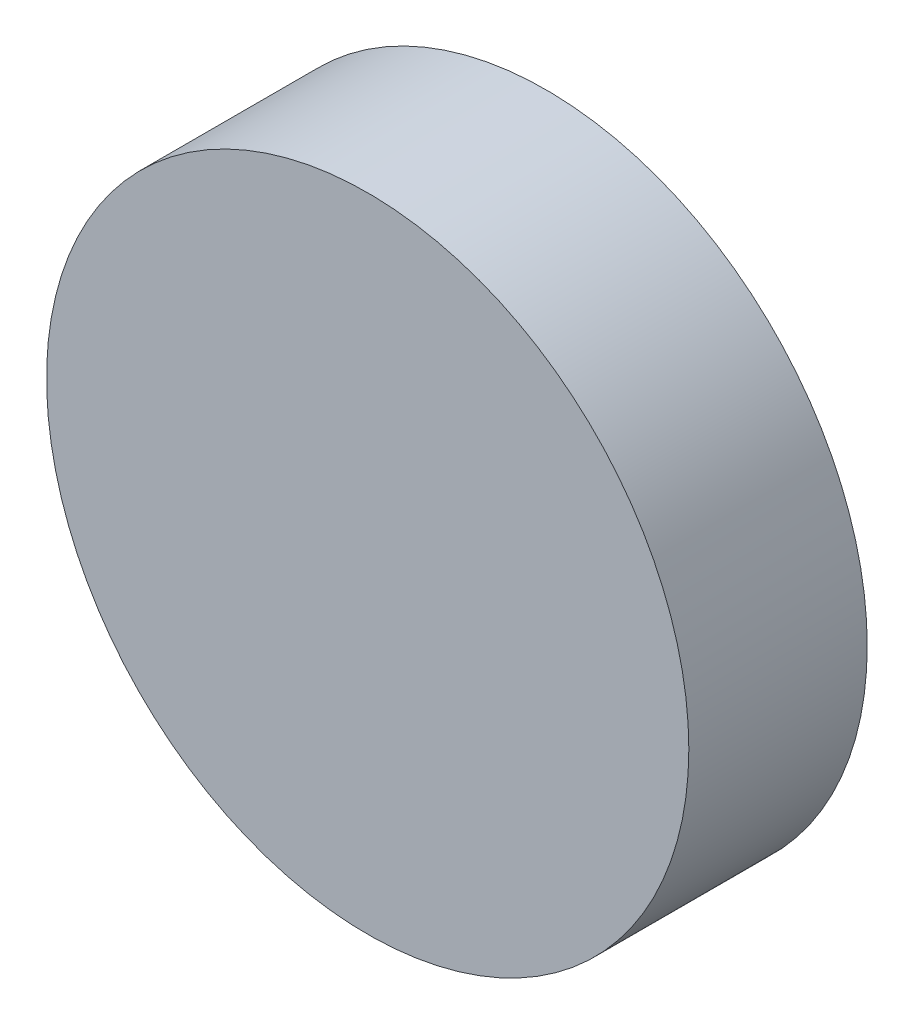
ISO-10303-21;
HEADER;
FILE_DESCRIPTION(('STEP AP214'),'2;1');
FILE_NAME('part.step','',(''),(''),'','','');
FILE_SCHEMA(('AUTOMOTIVE_DESIGN { 1 0 10303 214 1 1 1 1 }'));
ENDSEC;
DATA;
#1=APPLICATION_CONTEXT('core data for automotive mechanical design processes');
#2=APPLICATION_PROTOCOL_DEFINITION('international standard','automotive_design',2000,#1);
#3=PRODUCT_CONTEXT('',#1,'mechanical');
#4=PRODUCT('Part','Part','',(#3));
#5=PRODUCT_RELATED_PRODUCT_CATEGORY('part','',(#4));
#6=PRODUCT_DEFINITION_FORMATION('','',#4);
#7=PRODUCT_DEFINITION_CONTEXT('part definition',#1,'design');
#8=PRODUCT_DEFINITION('design','',#6,#7);
#9=PRODUCT_DEFINITION_SHAPE('','',#8);
#10=(LENGTH_UNIT() NAMED_UNIT(*) SI_UNIT(.MILLI.,.METRE.));
#11=(NAMED_UNIT(*) PLANE_ANGLE_UNIT() SI_UNIT($,.RADIAN.));
#12=(NAMED_UNIT(*) SI_UNIT($,.STERADIAN.) SOLID_ANGLE_UNIT());
#13=UNCERTAINTY_MEASURE_WITH_UNIT(LENGTH_MEASURE(1.E-05),#10,'distance_accuracy_value','');
#14=(GEOMETRIC_REPRESENTATION_CONTEXT(3) GLOBAL_UNCERTAINTY_ASSIGNED_CONTEXT((#13)) GLOBAL_UNIT_ASSIGNED_CONTEXT((#10,
#11,#12)) REPRESENTATION_CONTEXT('',''));
#15=CARTESIAN_POINT('',(0.,0.,0.));
#16=DIRECTION('',(0.,0.,1.));
#17=DIRECTION('',(1.,0.,0.));
#18=AXIS2_PLACEMENT_3D('',#15,#16,#17);
#19=CARTESIAN_POINT('',(40.5060478881834,0.762412285703871,5.));
#20=DIRECTION('',(0.,0.,-1.));
#21=DIRECTION('',(-1.,0.,0.));
#22=AXIS2_PLACEMENT_3D('',#19,#20,#21);
#23=CYLINDRICAL_SURFACE('',#22,9.);
#24=CARTESIAN_POINT('',(40.5060478881834,0.762412285703871,5.));
#25=DIRECTION('',(0.,0.,1.));
#26=DIRECTION('',(1.,0.,0.));
#27=AXIS2_PLACEMENT_3D('',#24,#25,#26);
#28=CIRCLE('',#27,9.);
#29=CARTESIAN_POINT('',(49.5060478881834,0.762412285703871,5.));
#30=VERTEX_POINT('',#29);
#31=EDGE_CURVE('E10',#30,#30,#28,.T.);
#32=ORIENTED_EDGE('',*,*,#31,.F.);
#33=EDGE_LOOP('',(#32));
#34=FACE_BOUND('',#33,.T.);
#35=CARTESIAN_POINT('',(40.5060478881834,0.762412285703871,0.));
#36=DIRECTION('',(0.,0.,1.));
#37=DIRECTION('',(1.,0.,0.));
#38=AXIS2_PLACEMENT_3D('',#35,#36,#37);
#39=CIRCLE('',#38,9.);
#40=CARTESIAN_POINT('',(49.5060478881834,0.762412285703871,0.));
#41=VERTEX_POINT('',#40);
#42=EDGE_CURVE('E36',#41,#41,#39,.T.);
#43=ORIENTED_EDGE('',*,*,#42,.T.);
#44=EDGE_LOOP('',(#43));
#45=FACE_BOUND('',#44,.T.);
#46=ADVANCED_FACE('F33',(#34,#45),#23,.T.);
#47=CARTESIAN_POINT('',(40.5060478881834,0.762412285703871,5.));
#48=DIRECTION('',(0.,0.,1.));
#49=DIRECTION('',(1.,0.,0.));
#50=AXIS2_PLACEMENT_3D('',#47,#48,#49);
#51=PLANE('',#50);
#52=ORIENTED_EDGE('',*,*,#31,.T.);
#53=EDGE_LOOP('',(#52));
#54=FACE_BOUND('',#53,.T.);
#55=ADVANCED_FACE('F48',(#54),#51,.T.);
#56=CARTESIAN_POINT('',(40.5060478881834,0.762412285703871,0.));
#57=DIRECTION('',(0.,0.,1.));
#58=DIRECTION('',(1.,0.,0.));
#59=AXIS2_PLACEMENT_3D('',#56,#57,#58);
#60=PLANE('',#59);
#61=ORIENTED_EDGE('',*,*,#42,.F.);
#62=EDGE_LOOP('',(#61));
#63=FACE_BOUND('',#62,.T.);
#64=ADVANCED_FACE('F46',(#63),#60,.F.);
#65=CLOSED_SHELL('',(#46,#55,#64));
#66=MANIFOLD_SOLID_BREP('B2',#65);
#67=ADVANCED_BREP_SHAPE_REPRESENTATION('',(#18,#66),#14);
#68=SHAPE_DEFINITION_REPRESENTATION(#9,#67);
ENDSEC;
END-ISO-10303-21;
